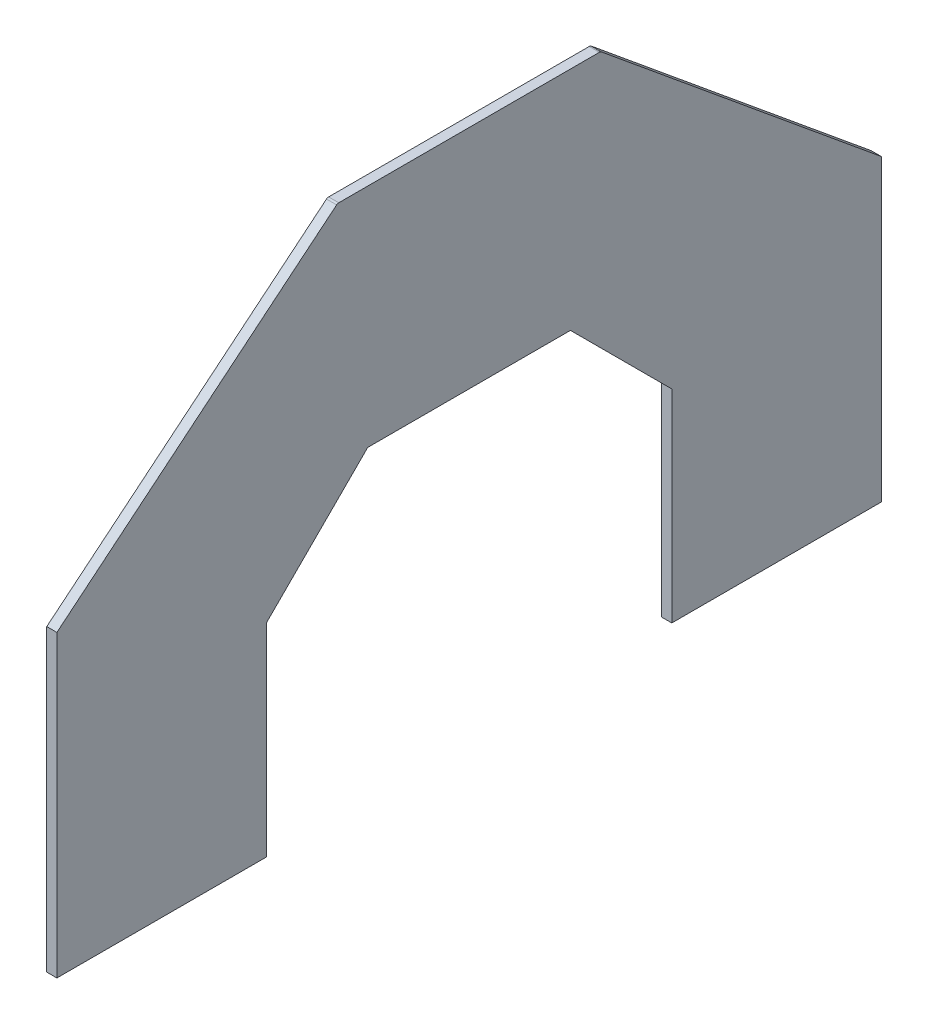
ISO-10303-21;
HEADER;
FILE_DESCRIPTION(('STEP AP214'),'2;1');
FILE_NAME('part.step','',(''),(''),'','','');
FILE_SCHEMA(('AUTOMOTIVE_DESIGN { 1 0 10303 214 1 1 1 1 }'));
ENDSEC;
DATA;
#1=APPLICATION_CONTEXT('core data for automotive mechanical design processes');
#2=APPLICATION_PROTOCOL_DEFINITION('international standard','automotive_design',2000,#1);
#3=PRODUCT_CONTEXT('',#1,'mechanical');
#4=PRODUCT('Part','Part','',(#3));
#5=PRODUCT_RELATED_PRODUCT_CATEGORY('part','',(#4));
#6=PRODUCT_DEFINITION_FORMATION('','',#4);
#7=PRODUCT_DEFINITION_CONTEXT('part definition',#1,'design');
#8=PRODUCT_DEFINITION('design','',#6,#7);
#9=PRODUCT_DEFINITION_SHAPE('','',#8);
#10=(LENGTH_UNIT() NAMED_UNIT(*) SI_UNIT(.MILLI.,.METRE.));
#11=(NAMED_UNIT(*) PLANE_ANGLE_UNIT() SI_UNIT($,.RADIAN.));
#12=(NAMED_UNIT(*) SI_UNIT($,.STERADIAN.) SOLID_ANGLE_UNIT());
#13=UNCERTAINTY_MEASURE_WITH_UNIT(LENGTH_MEASURE(1.E-05),#10,'distance_accuracy_value','');
#14=(GEOMETRIC_REPRESENTATION_CONTEXT(3) GLOBAL_UNCERTAINTY_ASSIGNED_CONTEXT((#13)) GLOBAL_UNIT_ASSIGNED_CONTEXT((#10,
#11,#12)) REPRESENTATION_CONTEXT('',''));
#15=CARTESIAN_POINT('',(0.,0.,0.));
#16=DIRECTION('',(0.,0.,1.));
#17=DIRECTION('',(1.,0.,0.));
#18=AXIS2_PLACEMENT_3D('',#15,#16,#17);
#19=CARTESIAN_POINT('',(-113.5,0.,-61.));
#20=DIRECTION('',(0.,1.,0.));
#21=DIRECTION('',(0.,0.,1.));
#22=AXIS2_PLACEMENT_3D('',#19,#20,#21);
#23=PLANE('',#22);
#24=DIRECTION('',(0.,0.,-1.));
#25=VECTOR('',#24,1.);
#26=CARTESIAN_POINT('',(-113.5,0.,-61.));
#27=LINE('',#26,#25);
#28=CARTESIAN_POINT('',(-113.5,0.,-30.));
#29=VERTEX_POINT('',#28);
#30=CARTESIAN_POINT('',(-113.5,0.,-61.));
#31=VERTEX_POINT('',#30);
#32=EDGE_CURVE('E101',#29,#31,#27,.T.);
#33=ORIENTED_EDGE('',*,*,#32,.F.);
#34=DIRECTION('',(-1.,0.,0.));
#35=VECTOR('',#34,1.);
#36=CARTESIAN_POINT('',(245.,0.,-30.));
#37=LINE('',#36,#35);
#38=CARTESIAN_POINT('',(-115.,0.,-30.));
#39=VERTEX_POINT('',#38);
#40=EDGE_CURVE('E212',#29,#39,#37,.T.);
#41=ORIENTED_EDGE('',*,*,#40,.T.);
#42=DIRECTION('',(0.,0.,-1.));
#43=VECTOR('',#42,1.);
#44=CARTESIAN_POINT('',(-115.,0.,-61.));
#45=LINE('',#44,#43);
#46=CARTESIAN_POINT('',(-115.,0.,-61.));
#47=VERTEX_POINT('',#46);
#48=EDGE_CURVE('E149',#39,#47,#45,.T.);
#49=ORIENTED_EDGE('',*,*,#48,.T.);
#50=DIRECTION('',(-1.,0.,0.));
#51=VECTOR('',#50,1.);
#52=CARTESIAN_POINT('',(-113.5,0.,-61.));
#53=LINE('',#52,#51);
#54=EDGE_CURVE('E11',#31,#47,#53,.T.);
#55=ORIENTED_EDGE('',*,*,#54,.F.);
#56=EDGE_LOOP('',(#33,#41,#49,#55));
#57=FACE_BOUND('',#56,.T.);
#58=ADVANCED_FACE('F36',(#57),#23,.F.);
#59=CARTESIAN_POINT('',(-115.,0.,61.));
#60=VERTEX_POINT('',#59);
#61=CARTESIAN_POINT('',(-115.,0.,30.));
#62=VERTEX_POINT('',#61);
#63=EDGE_CURVE('E145',#60,#62,#45,.T.);
#64=ORIENTED_EDGE('',*,*,#63,.T.);
#65=DIRECTION('',(-1.,0.,0.));
#66=VECTOR('',#65,1.);
#67=CARTESIAN_POINT('',(245.,0.,30.));
#68=LINE('',#67,#66);
#69=CARTESIAN_POINT('',(-113.5,0.,30.));
#70=VERTEX_POINT('',#69);
#71=EDGE_CURVE('E51',#70,#62,#68,.T.);
#72=ORIENTED_EDGE('',*,*,#71,.F.);
#73=CARTESIAN_POINT('',(-113.5,0.,61.));
#74=VERTEX_POINT('',#73);
#75=EDGE_CURVE('E196',#74,#70,#27,.T.);
#76=ORIENTED_EDGE('',*,*,#75,.F.);
#77=DIRECTION('',(-1.,0.,0.));
#78=VECTOR('',#77,1.);
#79=CARTESIAN_POINT('',(-113.5,0.,61.));
#80=LINE('',#79,#78);
#81=EDGE_CURVE('E141',#74,#60,#80,.T.);
#82=ORIENTED_EDGE('',*,*,#81,.T.);
#83=EDGE_LOOP('',(#64,#72,#76,#82));
#84=FACE_BOUND('',#83,.T.);
#85=ADVANCED_FACE('F38',(#84),#23,.F.);
#86=CARTESIAN_POINT('',(-113.5,0.,-61.));
#87=DIRECTION('',(0.,0.,1.));
#88=DIRECTION('',(1.,0.,0.));
#89=AXIS2_PLACEMENT_3D('',#86,#87,#88);
#90=PLANE('',#89);
#91=DIRECTION('',(0.,1.,0.));
#92=VECTOR('',#91,1.);
#93=CARTESIAN_POINT('',(-115.,0.,-61.));
#94=LINE('',#93,#92);
#95=CARTESIAN_POINT('',(-115.,44.2921133342166,-61.));
#96=VERTEX_POINT('',#95);
#97=EDGE_CURVE('E148',#47,#96,#94,.T.);
#98=ORIENTED_EDGE('',*,*,#97,.T.);
#99=DIRECTION('',(-1.,0.,0.));
#100=VECTOR('',#99,1.);
#101=CARTESIAN_POINT('',(-113.5,44.2921133342166,-61.));
#102=LINE('',#101,#100);
#103=CARTESIAN_POINT('',(-113.5,44.2921133342166,-61.));
#104=VERTEX_POINT('',#103);
#105=EDGE_CURVE('E44',#104,#96,#102,.T.);
#106=ORIENTED_EDGE('',*,*,#105,.F.);
#107=DIRECTION('',(0.,1.,0.));
#108=VECTOR('',#107,1.);
#109=CARTESIAN_POINT('',(-113.5,0.,-61.));
#110=LINE('',#109,#108);
#111=EDGE_CURVE('E194',#31,#104,#110,.T.);
#112=ORIENTED_EDGE('',*,*,#111,.F.);
#113=ORIENTED_EDGE('',*,*,#54,.T.);
#114=EDGE_LOOP('',(#98,#106,#112,#113));
#115=FACE_BOUND('',#114,.T.);
#116=ADVANCED_FACE('F281',(#115),#90,.F.);
#117=CARTESIAN_POINT('',(-113.5,78.3859651178085,-19.6003228342098));
#118=DIRECTION('',(0.,-0.77193023561705,0.6357072528611));
#119=DIRECTION('',(0.,-0.6357072528611,-0.77193023561705));
#120=AXIS2_PLACEMENT_3D('',#117,#118,#119);
#121=PLANE('',#120);
#122=DIRECTION('',(0.,0.6357072528611,0.77193023561705));
#123=VECTOR('',#122,1.);
#124=CARTESIAN_POINT('',(-115.,78.3859651178085,-19.6003228342098));
#125=LINE('',#124,#123);
#126=CARTESIAN_POINT('',(-115.,78.3859651178085,-19.6003228342098));
#127=VERTEX_POINT('',#126);
#128=EDGE_CURVE('E151',#96,#127,#125,.T.);
#129=ORIENTED_EDGE('',*,*,#128,.T.);
#130=DIRECTION('',(-1.,0.,0.));
#131=VECTOR('',#130,1.);
#132=CARTESIAN_POINT('',(-113.5,78.3859651178085,-19.6003228342098));
#133=LINE('',#132,#131);
#134=CARTESIAN_POINT('',(-113.5,78.3859651178085,-19.6003228342098));
#135=VERTEX_POINT('',#134);
#136=EDGE_CURVE('E167',#135,#127,#133,.T.);
#137=ORIENTED_EDGE('',*,*,#136,.F.);
#138=DIRECTION('',(0.,0.6357072528611,0.77193023561705));
#139=VECTOR('',#138,1.);
#140=CARTESIAN_POINT('',(-113.5,78.3859651178085,-19.6003228342098));
#141=LINE('',#140,#139);
#142=EDGE_CURVE('E176',#104,#135,#141,.T.);
#143=ORIENTED_EDGE('',*,*,#142,.F.);
#144=ORIENTED_EDGE('',*,*,#105,.T.);
#145=EDGE_LOOP('',(#129,#137,#143,#144));
#146=FACE_BOUND('',#145,.T.);
#147=ADVANCED_FACE('F174',(#146),#121,.F.);
#148=CARTESIAN_POINT('',(-113.5,78.,-19.2824692077793));
#149=DIRECTION('',(-1.,0.,0.));
#150=DIRECTION('',(0.,0.,1.));
#151=AXIS2_PLACEMENT_3D('',#148,#149,#150);
#152=CYLINDRICAL_SURFACE('',#151,0.500000000000005);
#153=CARTESIAN_POINT('',(-115.,78.,-19.2824692077793));
#154=DIRECTION('',(1.,0.,0.));
#155=DIRECTION('',(0.,0.,-1.));
#156=AXIS2_PLACEMENT_3D('',#153,#154,#155);
#157=CIRCLE('',#156,0.500000000000005);
#158=CARTESIAN_POINT('',(-115.,78.5,-19.2824692077793));
#159=VERTEX_POINT('',#158);
#160=EDGE_CURVE('E153',#127,#159,#157,.T.);
#161=ORIENTED_EDGE('',*,*,#160,.T.);
#162=DIRECTION('',(-1.,0.,0.));
#163=VECTOR('',#162,1.);
#164=CARTESIAN_POINT('',(-113.5,78.5,-19.2824692077793));
#165=LINE('',#164,#163);
#166=CARTESIAN_POINT('',(-113.5,78.5,-19.2824692077793));
#167=VERTEX_POINT('',#166);
#168=EDGE_CURVE('E164',#167,#159,#165,.T.);
#169=ORIENTED_EDGE('',*,*,#168,.F.);
#170=CARTESIAN_POINT('',(-113.5,78.,-19.2824692077793));
#171=DIRECTION('',(1.,0.,0.));
#172=DIRECTION('',(0.,0.,-1.));
#173=AXIS2_PLACEMENT_3D('',#170,#171,#172);
#174=CIRCLE('',#173,0.500000000000005);
#175=EDGE_CURVE('E190',#135,#167,#174,.T.);
#176=ORIENTED_EDGE('',*,*,#175,.F.);
#177=ORIENTED_EDGE('',*,*,#136,.T.);
#178=EDGE_LOOP('',(#161,#169,#176,#177));
#179=FACE_BOUND('',#178,.T.);
#180=ADVANCED_FACE('F186',(#179),#152,.T.);
#181=CARTESIAN_POINT('',(-113.5,78.5,19.2824692077793));
#182=DIRECTION('',(0.,-1.,0.));
#183=DIRECTION('',(0.,0.,-1.));
#184=AXIS2_PLACEMENT_3D('',#181,#182,#183);
#185=PLANE('',#184);
#186=DIRECTION('',(0.,0.,1.));
#187=VECTOR('',#186,1.);
#188=CARTESIAN_POINT('',(-115.,78.5,19.2824692077793));
#189=LINE('',#188,#187);
#190=CARTESIAN_POINT('',(-115.,78.5,19.2824692077793));
#191=VERTEX_POINT('',#190);
#192=EDGE_CURVE('E155',#159,#191,#189,.T.);
#193=ORIENTED_EDGE('',*,*,#192,.T.);
#194=DIRECTION('',(-1.,0.,0.));
#195=VECTOR('',#194,1.);
#196=CARTESIAN_POINT('',(-113.5,78.5,19.2824692077793));
#197=LINE('',#196,#195);
#198=CARTESIAN_POINT('',(-113.5,78.5,19.2824692077793));
#199=VERTEX_POINT('',#198);
#200=EDGE_CURVE('E136',#199,#191,#197,.T.);
#201=ORIENTED_EDGE('',*,*,#200,.F.);
#202=DIRECTION('',(0.,0.,1.));
#203=VECTOR('',#202,1.);
#204=CARTESIAN_POINT('',(-113.5,78.5,19.2824692077793));
#205=LINE('',#204,#203);
#206=EDGE_CURVE('E124',#167,#199,#205,.T.);
#207=ORIENTED_EDGE('',*,*,#206,.F.);
#208=ORIENTED_EDGE('',*,*,#168,.T.);
#209=EDGE_LOOP('',(#193,#201,#207,#208));
#210=FACE_BOUND('',#209,.T.);
#211=ADVANCED_FACE('F189',(#210),#185,.F.);
#212=CARTESIAN_POINT('',(-113.5,78.,19.2824692077792));
#213=DIRECTION('',(-1.,0.,0.));
#214=DIRECTION('',(0.,0.,1.));
#215=AXIS2_PLACEMENT_3D('',#212,#213,#214);
#216=CYLINDRICAL_SURFACE('',#215,0.499999999999996);
#217=CARTESIAN_POINT('',(-115.,78.,19.2824692077792));
#218=DIRECTION('',(1.,0.,0.));
#219=DIRECTION('',(0.,0.,-1.));
#220=AXIS2_PLACEMENT_3D('',#217,#218,#219);
#221=CIRCLE('',#220,0.499999999999996);
#222=CARTESIAN_POINT('',(-115.,78.3859651178085,19.6003228342098));
#223=VERTEX_POINT('',#222);
#224=EDGE_CURVE('E133',#191,#223,#221,.T.);
#225=ORIENTED_EDGE('',*,*,#224,.T.);
#226=DIRECTION('',(-1.,0.,0.));
#227=VECTOR('',#226,1.);
#228=CARTESIAN_POINT('',(-113.5,78.3859651178085,19.6003228342098));
#229=LINE('',#228,#227);
#230=CARTESIAN_POINT('',(-113.5,78.3859651178085,19.6003228342098));
#231=VERTEX_POINT('',#230);
#232=EDGE_CURVE('E130',#231,#223,#229,.T.);
#233=ORIENTED_EDGE('',*,*,#232,.F.);
#234=CARTESIAN_POINT('',(-113.5,78.,19.2824692077792));
#235=DIRECTION('',(1.,0.,0.));
#236=DIRECTION('',(0.,0.,-1.));
#237=AXIS2_PLACEMENT_3D('',#234,#235,#236);
#238=CIRCLE('',#237,0.499999999999996);
#239=EDGE_CURVE('E117',#199,#231,#238,.T.);
#240=ORIENTED_EDGE('',*,*,#239,.F.);
#241=ORIENTED_EDGE('',*,*,#200,.T.);
#242=EDGE_LOOP('',(#225,#233,#240,#241));
#243=FACE_BOUND('',#242,.T.);
#244=ADVANCED_FACE('F131',(#243),#216,.T.);
#245=CARTESIAN_POINT('',(-113.5,44.2921133342166,61.));
#246=DIRECTION('',(0.,-0.771930235617049,-0.6357072528611));
#247=DIRECTION('',(0.,0.6357072528611,-0.77193023561705));
#248=AXIS2_PLACEMENT_3D('',#245,#246,#247);
#249=PLANE('',#248);
#250=DIRECTION('',(0.,-0.6357072528611,0.771930235617049));
#251=VECTOR('',#250,1.);
#252=CARTESIAN_POINT('',(-115.,44.2921133342166,61.));
#253=LINE('',#252,#251);
#254=CARTESIAN_POINT('',(-115.,44.2921133342166,61.));
#255=VERTEX_POINT('',#254);
#256=EDGE_CURVE('E158',#223,#255,#253,.T.);
#257=ORIENTED_EDGE('',*,*,#256,.T.);
#258=DIRECTION('',(-1.,0.,0.));
#259=VECTOR('',#258,1.);
#260=CARTESIAN_POINT('',(-113.5,44.2921133342166,61.));
#261=LINE('',#260,#259);
#262=CARTESIAN_POINT('',(-113.5,44.2921133342166,61.));
#263=VERTEX_POINT('',#262);
#264=EDGE_CURVE('E137',#263,#255,#261,.T.);
#265=ORIENTED_EDGE('',*,*,#264,.F.);
#266=DIRECTION('',(0.,-0.6357072528611,0.771930235617049));
#267=VECTOR('',#266,1.);
#268=CARTESIAN_POINT('',(-113.5,44.2921133342166,61.));
#269=LINE('',#268,#267);
#270=EDGE_CURVE('E121',#231,#263,#269,.T.);
#271=ORIENTED_EDGE('',*,*,#270,.F.);
#272=ORIENTED_EDGE('',*,*,#232,.T.);
#273=EDGE_LOOP('',(#257,#265,#271,#272));
#274=FACE_BOUND('',#273,.T.);
#275=ADVANCED_FACE('F139',(#274),#249,.F.);
#276=CARTESIAN_POINT('',(-113.5,44.2921133342166,61.));
#277=DIRECTION('',(0.,0.,-1.));
#278=DIRECTION('',(-1.,0.,0.));
#279=AXIS2_PLACEMENT_3D('',#276,#277,#278);
#280=PLANE('',#279);
#281=DIRECTION('',(0.,-1.,0.));
#282=VECTOR('',#281,1.);
#283=CARTESIAN_POINT('',(-115.,44.2921133342166,61.));
#284=LINE('',#283,#282);
#285=EDGE_CURVE('E93',#255,#60,#284,.T.);
#286=ORIENTED_EDGE('',*,*,#285,.T.);
#287=ORIENTED_EDGE('',*,*,#81,.F.);
#288=DIRECTION('',(0.,-1.,0.));
#289=VECTOR('',#288,1.);
#290=CARTESIAN_POINT('',(-113.5,44.2921133342166,61.));
#291=LINE('',#290,#289);
#292=EDGE_CURVE('E60',#263,#74,#291,.T.);
#293=ORIENTED_EDGE('',*,*,#292,.F.);
#294=ORIENTED_EDGE('',*,*,#264,.T.);
#295=EDGE_LOOP('',(#286,#287,#293,#294));
#296=FACE_BOUND('',#295,.T.);
#297=ADVANCED_FACE('F348',(#296),#280,.F.);
#298=CARTESIAN_POINT('',(-113.5,78.,19.2824692077792));
#299=DIRECTION('',(1.,0.,0.));
#300=DIRECTION('',(0.,0.,-1.));
#301=AXIS2_PLACEMENT_3D('',#298,#299,#300);
#302=PLANE('',#301);
#303=DIRECTION('',(0.,1.,0.));
#304=VECTOR('',#303,1.);
#305=CARTESIAN_POINT('',(-113.5,78.,-30.));
#306=LINE('',#305,#304);
#307=CARTESIAN_POINT('',(-113.5,30.,-30.));
#308=VERTEX_POINT('',#307);
#309=EDGE_CURVE('E198',#29,#308,#306,.T.);
#310=ORIENTED_EDGE('',*,*,#309,.F.);
#311=ORIENTED_EDGE('',*,*,#32,.T.);
#312=ORIENTED_EDGE('',*,*,#111,.T.);
#313=ORIENTED_EDGE('',*,*,#142,.T.);
#314=ORIENTED_EDGE('',*,*,#175,.T.);
#315=ORIENTED_EDGE('',*,*,#206,.T.);
#316=ORIENTED_EDGE('',*,*,#239,.T.);
#317=ORIENTED_EDGE('',*,*,#270,.T.);
#318=ORIENTED_EDGE('',*,*,#292,.T.);
#319=ORIENTED_EDGE('',*,*,#75,.T.);
#320=DIRECTION('',(0.,-1.,0.));
#321=VECTOR('',#320,1.);
#322=CARTESIAN_POINT('',(-113.5,78.,30.));
#323=LINE('',#322,#321);
#324=CARTESIAN_POINT('',(-113.5,30.,30.));
#325=VERTEX_POINT('',#324);
#326=EDGE_CURVE('E210',#325,#70,#323,.T.);
#327=ORIENTED_EDGE('',*,*,#326,.F.);
#328=DIRECTION('',(0.,-0.707106781186548,0.707106781186548));
#329=VECTOR('',#328,1.);
#330=CARTESIAN_POINT('',(-113.5,59.3587653961104,0.64123460388962));
#331=LINE('',#330,#329);
#332=CARTESIAN_POINT('',(-113.5,45.,15.));
#333=VERTEX_POINT('',#332);
#334=EDGE_CURVE('E207',#333,#325,#331,.T.);
#335=ORIENTED_EDGE('',*,*,#334,.F.);
#336=DIRECTION('',(0.,0.,1.));
#337=VECTOR('',#336,1.);
#338=CARTESIAN_POINT('',(-113.5,45.,19.2824692077792));
#339=LINE('',#338,#337);
#340=CARTESIAN_POINT('',(-113.5,45.,-15.));
#341=VERTEX_POINT('',#340);
#342=EDGE_CURVE('E204',#341,#333,#339,.T.);
#343=ORIENTED_EDGE('',*,*,#342,.F.);
#344=DIRECTION('',(0.,0.707106781186548,0.707106781186548));
#345=VECTOR('',#344,1.);
#346=CARTESIAN_POINT('',(-113.5,78.6412346038896,18.6412346038896));
#347=LINE('',#346,#345);
#348=EDGE_CURVE('E201',#308,#341,#347,.T.);
#349=ORIENTED_EDGE('',*,*,#348,.F.);
#350=EDGE_LOOP('',(#310,#311,#312,#313,#314,#315,#316,#317,#318,#319,#327,#335,#343,#349));
#351=FACE_BOUND('',#350,.T.);
#352=ADVANCED_FACE('F119',(#351),#302,.T.);
#353=CARTESIAN_POINT('',(-115.,78.,19.2824692077792));
#354=DIRECTION('',(1.,0.,0.));
#355=DIRECTION('',(0.,0.,-1.));
#356=AXIS2_PLACEMENT_3D('',#353,#354,#355);
#357=PLANE('',#356);
#358=ORIENTED_EDGE('',*,*,#48,.F.);
#359=DIRECTION('',(0.,-1.,0.));
#360=VECTOR('',#359,1.);
#361=CARTESIAN_POINT('',(-115.,0.,-30.));
#362=LINE('',#361,#360);
#363=CARTESIAN_POINT('',(-115.,30.,-30.));
#364=VERTEX_POINT('',#363);
#365=EDGE_CURVE('E215',#364,#39,#362,.T.);
#366=ORIENTED_EDGE('',*,*,#365,.F.);
#367=DIRECTION('',(0.,-0.707106781186547,-0.707106781186547));
#368=VECTOR('',#367,1.);
#369=CARTESIAN_POINT('',(-115.,30.,-30.));
#370=LINE('',#369,#368);
#371=CARTESIAN_POINT('',(-115.,45.,-15.));
#372=VERTEX_POINT('',#371);
#373=EDGE_CURVE('E231',#372,#364,#370,.T.);
#374=ORIENTED_EDGE('',*,*,#373,.F.);
#375=DIRECTION('',(0.,0.,-1.));
#376=VECTOR('',#375,1.);
#377=CARTESIAN_POINT('',(-115.,45.,-15.));
#378=LINE('',#377,#376);
#379=CARTESIAN_POINT('',(-115.,45.,15.));
#380=VERTEX_POINT('',#379);
#381=EDGE_CURVE('E234',#380,#372,#378,.T.);
#382=ORIENTED_EDGE('',*,*,#381,.F.);
#383=DIRECTION('',(0.,0.707106781186547,-0.707106781186547));
#384=VECTOR('',#383,1.);
#385=CARTESIAN_POINT('',(-115.,30.,30.));
#386=LINE('',#385,#384);
#387=CARTESIAN_POINT('',(-115.,30.,30.));
#388=VERTEX_POINT('',#387);
#389=EDGE_CURVE('E237',#388,#380,#386,.T.);
#390=ORIENTED_EDGE('',*,*,#389,.F.);
#391=DIRECTION('',(0.,1.,0.));
#392=VECTOR('',#391,1.);
#393=CARTESIAN_POINT('',(-115.,0.,30.));
#394=LINE('',#393,#392);
#395=EDGE_CURVE('E240',#62,#388,#394,.T.);
#396=ORIENTED_EDGE('',*,*,#395,.F.);
#397=ORIENTED_EDGE('',*,*,#63,.F.);
#398=ORIENTED_EDGE('',*,*,#285,.F.);
#399=ORIENTED_EDGE('',*,*,#256,.F.);
#400=ORIENTED_EDGE('',*,*,#224,.F.);
#401=ORIENTED_EDGE('',*,*,#192,.F.);
#402=ORIENTED_EDGE('',*,*,#160,.F.);
#403=ORIENTED_EDGE('',*,*,#128,.F.);
#404=ORIENTED_EDGE('',*,*,#97,.F.);
#405=EDGE_LOOP('',(#358,#366,#374,#382,#390,#396,#397,#398,#399,#400,#401,#402,#403,#404));
#406=FACE_BOUND('',#405,.T.);
#407=ADVANCED_FACE('F182',(#406),#357,.F.);
#408=CARTESIAN_POINT('',(245.,0.,-30.));
#409=DIRECTION('',(0.,0.,-1.));
#410=DIRECTION('',(-1.,0.,0.));
#411=AXIS2_PLACEMENT_3D('',#408,#409,#410);
#412=PLANE('',#411);
#413=ORIENTED_EDGE('',*,*,#309,.T.);
#414=DIRECTION('',(-1.,0.,0.));
#415=VECTOR('',#414,1.);
#416=CARTESIAN_POINT('',(245.,30.,-30.));
#417=LINE('',#416,#415);
#418=EDGE_CURVE('E224',#308,#364,#417,.T.);
#419=ORIENTED_EDGE('',*,*,#418,.T.);
#420=ORIENTED_EDGE('',*,*,#365,.T.);
#421=ORIENTED_EDGE('',*,*,#40,.F.);
#422=EDGE_LOOP('',(#413,#419,#420,#421));
#423=FACE_BOUND('',#422,.T.);
#424=ADVANCED_FACE('F275',(#423),#412,.F.);
#425=CARTESIAN_POINT('',(245.,30.,-30.));
#426=DIRECTION('',(0.,0.707106781186547,-0.707106781186547));
#427=DIRECTION('',(0.,0.707106781186548,0.707106781186548));
#428=AXIS2_PLACEMENT_3D('',#425,#426,#427);
#429=PLANE('',#428);
#430=ORIENTED_EDGE('',*,*,#348,.T.);
#431=DIRECTION('',(-1.,0.,0.));
#432=VECTOR('',#431,1.);
#433=CARTESIAN_POINT('',(245.,45.,-15.));
#434=LINE('',#433,#432);
#435=EDGE_CURVE('E221',#341,#372,#434,.T.);
#436=ORIENTED_EDGE('',*,*,#435,.T.);
#437=ORIENTED_EDGE('',*,*,#373,.T.);
#438=ORIENTED_EDGE('',*,*,#418,.F.);
#439=EDGE_LOOP('',(#430,#436,#437,#438));
#440=FACE_BOUND('',#439,.T.);
#441=ADVANCED_FACE('F384',(#440),#429,.F.);
#442=CARTESIAN_POINT('',(245.,45.,-15.));
#443=DIRECTION('',(0.,1.,0.));
#444=DIRECTION('',(0.,0.,1.));
#445=AXIS2_PLACEMENT_3D('',#442,#443,#444);
#446=PLANE('',#445);
#447=ORIENTED_EDGE('',*,*,#342,.T.);
#448=DIRECTION('',(-1.,0.,0.));
#449=VECTOR('',#448,1.);
#450=CARTESIAN_POINT('',(245.,45.,15.));
#451=LINE('',#450,#449);
#452=EDGE_CURVE('E218',#333,#380,#451,.T.);
#453=ORIENTED_EDGE('',*,*,#452,.T.);
#454=ORIENTED_EDGE('',*,*,#381,.T.);
#455=ORIENTED_EDGE('',*,*,#435,.F.);
#456=EDGE_LOOP('',(#447,#453,#454,#455));
#457=FACE_BOUND('',#456,.T.);
#458=ADVANCED_FACE('F394',(#457),#446,.F.);
#459=CARTESIAN_POINT('',(245.,30.,30.));
#460=DIRECTION('',(0.,0.707106781186547,0.707106781186547));
#461=DIRECTION('',(0.,-0.707106781186548,0.707106781186548));
#462=AXIS2_PLACEMENT_3D('',#459,#460,#461);
#463=PLANE('',#462);
#464=ORIENTED_EDGE('',*,*,#334,.T.);
#465=DIRECTION('',(-1.,0.,0.));
#466=VECTOR('',#465,1.);
#467=CARTESIAN_POINT('',(245.,30.,30.));
#468=LINE('',#467,#466);
#469=EDGE_CURVE('E214',#325,#388,#468,.T.);
#470=ORIENTED_EDGE('',*,*,#469,.T.);
#471=ORIENTED_EDGE('',*,*,#389,.T.);
#472=ORIENTED_EDGE('',*,*,#452,.F.);
#473=EDGE_LOOP('',(#464,#470,#471,#472));
#474=FACE_BOUND('',#473,.T.);
#475=ADVANCED_FACE('F254',(#474),#463,.F.);
#476=CARTESIAN_POINT('',(245.,0.,30.));
#477=DIRECTION('',(0.,0.,1.));
#478=DIRECTION('',(1.,0.,0.));
#479=AXIS2_PLACEMENT_3D('',#476,#477,#478);
#480=PLANE('',#479);
#481=ORIENTED_EDGE('',*,*,#326,.T.);
#482=ORIENTED_EDGE('',*,*,#71,.T.);
#483=ORIENTED_EDGE('',*,*,#395,.T.);
#484=ORIENTED_EDGE('',*,*,#469,.F.);
#485=EDGE_LOOP('',(#481,#482,#483,#484));
#486=FACE_BOUND('',#485,.T.);
#487=ADVANCED_FACE('F244',(#486),#480,.F.);
#488=CLOSED_SHELL('',(#58,#85,#116,#147,#180,#211,#244,#275,#297,#352,#407,#424,#441,#458,#475,#487));
#489=MANIFOLD_SOLID_BREP('B2',#488);
#490=ADVANCED_BREP_SHAPE_REPRESENTATION('',(#18,#489),#14);
#491=SHAPE_DEFINITION_REPRESENTATION(#9,#490);
ENDSEC;
END-ISO-10303-21;
